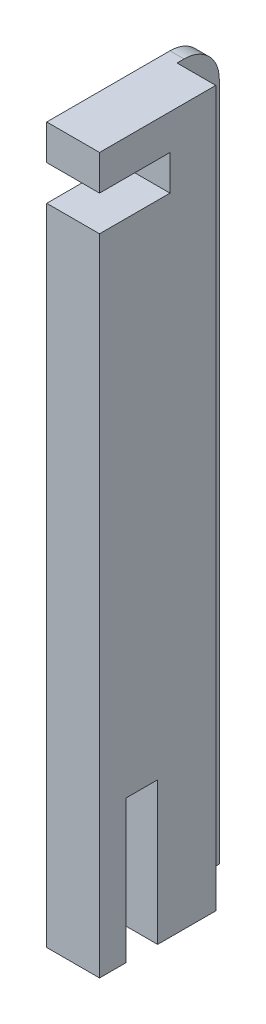
ISO-10303-21;
HEADER;
FILE_DESCRIPTION(('STEP AP214'),'2;1');
FILE_NAME('part.step','',(''),(''),'','','');
FILE_SCHEMA(('AUTOMOTIVE_DESIGN { 1 0 10303 214 1 1 1 1 }'));
ENDSEC;
DATA;
#1=APPLICATION_CONTEXT('core data for automotive mechanical design processes');
#2=APPLICATION_PROTOCOL_DEFINITION('international standard','automotive_design',2000,#1);
#3=PRODUCT_CONTEXT('',#1,'mechanical');
#4=PRODUCT('Part','Part','',(#3));
#5=PRODUCT_RELATED_PRODUCT_CATEGORY('part','',(#4));
#6=PRODUCT_DEFINITION_FORMATION('','',#4);
#7=PRODUCT_DEFINITION_CONTEXT('part definition',#1,'design');
#8=PRODUCT_DEFINITION('design','',#6,#7);
#9=PRODUCT_DEFINITION_SHAPE('','',#8);
#10=(LENGTH_UNIT() NAMED_UNIT(*) SI_UNIT(.MILLI.,.METRE.));
#11=(NAMED_UNIT(*) PLANE_ANGLE_UNIT() SI_UNIT($,.RADIAN.));
#12=(NAMED_UNIT(*) SI_UNIT($,.STERADIAN.) SOLID_ANGLE_UNIT());
#13=UNCERTAINTY_MEASURE_WITH_UNIT(LENGTH_MEASURE(1.E-05),#10,'distance_accuracy_value','');
#14=(GEOMETRIC_REPRESENTATION_CONTEXT(3) GLOBAL_UNCERTAINTY_ASSIGNED_CONTEXT((#13)) GLOBAL_UNIT_ASSIGNED_CONTEXT((#10,
#11,#12)) REPRESENTATION_CONTEXT('',''));
#15=CARTESIAN_POINT('',(0.,0.,0.));
#16=DIRECTION('',(0.,0.,1.));
#17=DIRECTION('',(1.,0.,0.));
#18=AXIS2_PLACEMENT_3D('',#15,#16,#17);
#19=CARTESIAN_POINT('',(0.,0.,26.));
#20=DIRECTION('',(0.,0.,1.));
#21=DIRECTION('',(1.,0.,0.));
#22=AXIS2_PLACEMENT_3D('',#19,#20,#21);
#23=PLANE('',#22);
#24=DIRECTION('',(0.,-1.,0.));
#25=VECTOR('',#24,1.);
#26=CARTESIAN_POINT('',(168.,-19.9999999999999,26.));
#27=LINE('',#26,#25);
#28=CARTESIAN_POINT('',(168.,0.,26.));
#29=VERTEX_POINT('',#28);
#30=CARTESIAN_POINT('',(168.,-9.99999999999994,26.));
#31=VERTEX_POINT('',#30);
#32=EDGE_CURVE('E233',#29,#31,#27,.T.);
#33=ORIENTED_EDGE('',*,*,#32,.T.);
#34=DIRECTION('',(1.,0.,0.));
#35=VECTOR('',#34,1.);
#36=CARTESIAN_POINT('',(-434.,-10.,26.));
#37=LINE('',#36,#35);
#38=CARTESIAN_POINT('',(183.,-9.99999999999994,26.));
#39=VERTEX_POINT('',#38);
#40=EDGE_CURVE('E194',#31,#39,#37,.T.);
#41=ORIENTED_EDGE('',*,*,#40,.T.);
#42=DIRECTION('',(0.,-1.,0.));
#43=VECTOR('',#42,1.);
#44=CARTESIAN_POINT('',(183.,0.,26.));
#45=LINE('',#44,#43);
#46=CARTESIAN_POINT('',(183.,0.,26.));
#47=VERTEX_POINT('',#46);
#48=EDGE_CURVE('E229',#47,#39,#45,.T.);
#49=ORIENTED_EDGE('',*,*,#48,.F.);
#50=DIRECTION('',(-1.,0.,0.));
#51=VECTOR('',#50,1.);
#52=CARTESIAN_POINT('',(-168.,0.,26.));
#53=LINE('',#52,#51);
#54=EDGE_CURVE('E223',#47,#29,#53,.T.);
#55=ORIENTED_EDGE('',*,*,#54,.T.);
#56=EDGE_LOOP('',(#33,#41,#49,#55));
#57=FACE_BOUND('',#56,.T.);
#58=ADVANCED_FACE('F35',(#57),#23,.T.);
#59=DIRECTION('',(-1.,0.,0.));
#60=VECTOR('',#59,1.);
#61=CARTESIAN_POINT('',(205.,-203.,26.));
#62=LINE('',#61,#60);
#63=CARTESIAN_POINT('',(183.,-203.,26.));
#64=VERTEX_POINT('',#63);
#65=CARTESIAN_POINT('',(168.,-203.,26.));
#66=VERTEX_POINT('',#65);
#67=EDGE_CURVE('E181',#64,#66,#62,.T.);
#68=ORIENTED_EDGE('',*,*,#67,.F.);
#69=CARTESIAN_POINT('',(183.,-20.,26.));
#70=VERTEX_POINT('',#69);
#71=EDGE_CURVE('E228',#70,#64,#45,.T.);
#72=ORIENTED_EDGE('',*,*,#71,.F.);
#73=DIRECTION('',(1.,0.,0.));
#74=VECTOR('',#73,1.);
#75=CARTESIAN_POINT('',(-434.,-20.,26.));
#76=LINE('',#75,#74);
#77=CARTESIAN_POINT('',(168.,-19.9999999999999,26.));
#78=VERTEX_POINT('',#77);
#79=EDGE_CURVE('E58',#78,#70,#76,.T.);
#80=ORIENTED_EDGE('',*,*,#79,.F.);
#81=EDGE_CURVE('E232',#78,#66,#27,.T.);
#82=ORIENTED_EDGE('',*,*,#81,.T.);
#83=EDGE_LOOP('',(#68,#72,#80,#82));
#84=FACE_BOUND('',#83,.T.);
#85=ADVANCED_FACE('F268',(#84),#23,.T.);
#86=CARTESIAN_POINT('',(168.,-19.9999999999999,26.));
#87=DIRECTION('',(1.,0.,0.));
#88=DIRECTION('',(0.,1.,0.));
#89=AXIS2_PLACEMENT_3D('',#86,#87,#88);
#90=PLANE('',#89);
#91=DIRECTION('',(0.,1.,0.));
#92=VECTOR('',#91,1.);
#93=CARTESIAN_POINT('',(168.,0.,18.5));
#94=LINE('',#93,#92);
#95=CARTESIAN_POINT('',(168.,-203.,18.5));
#96=VERTEX_POINT('',#95);
#97=CARTESIAN_POINT('',(168.,-162.5,18.5));
#98=VERTEX_POINT('',#97);
#99=EDGE_CURVE('E170',#96,#98,#94,.T.);
#100=ORIENTED_EDGE('',*,*,#99,.F.);
#101=DIRECTION('',(0.,0.,-1.));
#102=VECTOR('',#101,1.);
#103=CARTESIAN_POINT('',(168.,-203.,0.));
#104=LINE('',#103,#102);
#105=EDGE_CURVE('E167',#66,#96,#104,.T.);
#106=ORIENTED_EDGE('',*,*,#105,.F.);
#107=ORIENTED_EDGE('',*,*,#81,.F.);
#108=DIRECTION('',(0.,0.,1.));
#109=VECTOR('',#108,1.);
#110=CARTESIAN_POINT('',(168.,-19.9999999999999,26.));
#111=LINE('',#110,#109);
#112=CARTESIAN_POINT('',(168.,-19.9999999999999,6.00000000000002));
#113=VERTEX_POINT('',#112);
#114=EDGE_CURVE('E197',#113,#78,#111,.T.);
#115=ORIENTED_EDGE('',*,*,#114,.F.);
#116=DIRECTION('',(0.,-1.,0.));
#117=VECTOR('',#116,1.);
#118=CARTESIAN_POINT('',(168.,-19.9999999999999,6.00000000000002));
#119=LINE('',#118,#117);
#120=CARTESIAN_POINT('',(168.,-9.99999999999994,6.00000000000002));
#121=VERTEX_POINT('',#120);
#122=EDGE_CURVE('E204',#121,#113,#119,.T.);
#123=ORIENTED_EDGE('',*,*,#122,.F.);
#124=DIRECTION('',(0.,0.,-1.));
#125=VECTOR('',#124,1.);
#126=CARTESIAN_POINT('',(168.,-9.99999999999994,26.));
#127=LINE('',#126,#125);
#128=EDGE_CURVE('E206',#31,#121,#127,.T.);
#129=ORIENTED_EDGE('',*,*,#128,.F.);
#130=ORIENTED_EDGE('',*,*,#32,.F.);
#131=DIRECTION('',(0.,0.,1.));
#132=VECTOR('',#131,1.);
#133=CARTESIAN_POINT('',(168.,0.,-19.));
#134=LINE('',#133,#132);
#135=CARTESIAN_POINT('',(168.,0.,-9.));
#136=VERTEX_POINT('',#135);
#137=EDGE_CURVE('E220',#136,#29,#134,.T.);
#138=ORIENTED_EDGE('',*,*,#137,.F.);
#139=CARTESIAN_POINT('',(168.,-9.99999999999996,-9.));
#140=DIRECTION('',(1.,0.,0.));
#141=DIRECTION('',(0.,1.,0.));
#142=AXIS2_PLACEMENT_3D('',#139,#140,#141);
#143=CIRCLE('',#142,10.);
#144=CARTESIAN_POINT('',(168.,-9.99999999999996,-19.));
#145=VERTEX_POINT('',#144);
#146=EDGE_CURVE('E245',#136,#145,#143,.F.);
#147=ORIENTED_EDGE('',*,*,#146,.T.);
#148=DIRECTION('',(0.,1.,0.));
#149=VECTOR('',#148,1.);
#150=CARTESIAN_POINT('',(168.,0.,-19.));
#151=LINE('',#150,#149);
#152=CARTESIAN_POINT('',(168.,-203.,-19.));
#153=VERTEX_POINT('',#152);
#154=EDGE_CURVE('E166',#153,#145,#151,.T.);
#155=ORIENTED_EDGE('',*,*,#154,.F.);
#156=DIRECTION('',(0.,0.,-1.));
#157=VECTOR('',#156,1.);
#158=CARTESIAN_POINT('',(168.,-203.,0.));
#159=LINE('',#158,#157);
#160=CARTESIAN_POINT('',(168.,-203.,9.5));
#161=VERTEX_POINT('',#160);
#162=EDGE_CURVE('E144',#161,#153,#159,.T.);
#163=ORIENTED_EDGE('',*,*,#162,.F.);
#164=DIRECTION('',(0.,-1.,0.));
#165=VECTOR('',#164,1.);
#166=CARTESIAN_POINT('',(168.,0.,9.5));
#167=LINE('',#166,#165);
#168=CARTESIAN_POINT('',(168.,-162.5,9.5));
#169=VERTEX_POINT('',#168);
#170=EDGE_CURVE('E154',#169,#161,#167,.T.);
#171=ORIENTED_EDGE('',*,*,#170,.F.);
#172=DIRECTION('',(0.,0.,-1.));
#173=VECTOR('',#172,1.);
#174=CARTESIAN_POINT('',(168.,-162.5,0.));
#175=LINE('',#174,#173);
#176=EDGE_CURVE('E151',#98,#169,#175,.T.);
#177=ORIENTED_EDGE('',*,*,#176,.F.);
#178=EDGE_LOOP('',(#100,#106,#107,#115,#123,#129,#130,#138,#147,#155,#163,#171,#177));
#179=FACE_BOUND('',#178,.T.);
#180=ADVANCED_FACE('F164',(#179),#90,.F.);
#181=CARTESIAN_POINT('',(183.,0.,26.));
#182=DIRECTION('',(1.,0.,0.));
#183=DIRECTION('',(0.,1.,0.));
#184=AXIS2_PLACEMENT_3D('',#181,#182,#183);
#185=PLANE('',#184);
#186=DIRECTION('',(0.,0.,1.));
#187=VECTOR('',#186,1.);
#188=CARTESIAN_POINT('',(183.,-203.,26.));
#189=LINE('',#188,#187);
#190=CARTESIAN_POINT('',(183.,-203.,18.5));
#191=VERTEX_POINT('',#190);
#192=EDGE_CURVE('E11',#191,#64,#189,.T.);
#193=ORIENTED_EDGE('',*,*,#192,.F.);
#194=DIRECTION('',(0.,-1.,0.));
#195=VECTOR('',#194,1.);
#196=CARTESIAN_POINT('',(183.,0.,18.5));
#197=LINE('',#196,#195);
#198=CARTESIAN_POINT('',(183.,-162.5,18.5));
#199=VERTEX_POINT('',#198);
#200=EDGE_CURVE('E43',#199,#191,#197,.T.);
#201=ORIENTED_EDGE('',*,*,#200,.F.);
#202=DIRECTION('',(0.,0.,1.));
#203=VECTOR('',#202,1.);
#204=CARTESIAN_POINT('',(183.,-162.5,26.));
#205=LINE('',#204,#203);
#206=CARTESIAN_POINT('',(183.,-162.5,9.5));
#207=VERTEX_POINT('',#206);
#208=EDGE_CURVE('E251',#207,#199,#205,.T.);
#209=ORIENTED_EDGE('',*,*,#208,.F.);
#210=DIRECTION('',(0.,1.,0.));
#211=VECTOR('',#210,1.);
#212=CARTESIAN_POINT('',(183.,0.,9.5));
#213=LINE('',#212,#211);
#214=CARTESIAN_POINT('',(183.,-203.,9.5));
#215=VERTEX_POINT('',#214);
#216=EDGE_CURVE('E249',#215,#207,#213,.T.);
#217=ORIENTED_EDGE('',*,*,#216,.F.);
#218=DIRECTION('',(0.,0.,1.));
#219=VECTOR('',#218,1.);
#220=CARTESIAN_POINT('',(183.,-203.,26.));
#221=LINE('',#220,#219);
#222=CARTESIAN_POINT('',(183.,-203.,-7.));
#223=VERTEX_POINT('',#222);
#224=EDGE_CURVE('E147',#223,#215,#221,.T.);
#225=ORIENTED_EDGE('',*,*,#224,.F.);
#226=DIRECTION('',(0.,-1.,0.));
#227=VECTOR('',#226,1.);
#228=CARTESIAN_POINT('',(183.,0.,-7.));
#229=LINE('',#228,#227);
#230=CARTESIAN_POINT('',(183.,0.,-7.));
#231=VERTEX_POINT('',#230);
#232=EDGE_CURVE('E208',#231,#223,#229,.T.);
#233=ORIENTED_EDGE('',*,*,#232,.F.);
#234=DIRECTION('',(0.,0.,-1.));
#235=VECTOR('',#234,1.);
#236=CARTESIAN_POINT('',(183.,0.,26.));
#237=LINE('',#236,#235);
#238=EDGE_CURVE('E236',#47,#231,#237,.T.);
#239=ORIENTED_EDGE('',*,*,#238,.F.);
#240=ORIENTED_EDGE('',*,*,#48,.T.);
#241=DIRECTION('',(0.,0.,-1.));
#242=VECTOR('',#241,1.);
#243=CARTESIAN_POINT('',(183.,-9.99999999999993,0.));
#244=LINE('',#243,#242);
#245=CARTESIAN_POINT('',(183.,-9.99999999999994,6.00000000000002));
#246=VERTEX_POINT('',#245);
#247=EDGE_CURVE('E186',#39,#246,#244,.T.);
#248=ORIENTED_EDGE('',*,*,#247,.T.);
#249=DIRECTION('',(0.,-1.,0.));
#250=VECTOR('',#249,1.);
#251=CARTESIAN_POINT('',(183.,0.,6.00000000000002));
#252=LINE('',#251,#250);
#253=CARTESIAN_POINT('',(183.,-19.9999999999999,6.00000000000002));
#254=VERTEX_POINT('',#253);
#255=EDGE_CURVE('E191',#246,#254,#252,.T.);
#256=ORIENTED_EDGE('',*,*,#255,.T.);
#257=DIRECTION('',(0.,0.,1.));
#258=VECTOR('',#257,1.);
#259=CARTESIAN_POINT('',(183.,-19.9999999999999,0.));
#260=LINE('',#259,#258);
#261=EDGE_CURVE('E189',#254,#70,#260,.T.);
#262=ORIENTED_EDGE('',*,*,#261,.T.);
#263=ORIENTED_EDGE('',*,*,#71,.T.);
#264=EDGE_LOOP('',(#193,#201,#209,#217,#225,#233,#239,#240,#248,#256,#262,#263));
#265=FACE_BOUND('',#264,.T.);
#266=ADVANCED_FACE('F265',(#265),#185,.T.);
#267=CARTESIAN_POINT('',(168.,0.,26.));
#268=DIRECTION('',(0.,1.,0.));
#269=DIRECTION('',(-1.,0.,0.));
#270=AXIS2_PLACEMENT_3D('',#267,#268,#269);
#271=PLANE('',#270);
#272=ORIENTED_EDGE('',*,*,#137,.T.);
#273=ORIENTED_EDGE('',*,*,#54,.F.);
#274=ORIENTED_EDGE('',*,*,#238,.T.);
#275=DIRECTION('',(1.,0.,0.));
#276=VECTOR('',#275,1.);
#277=CARTESIAN_POINT('',(0.,0.,-7.));
#278=LINE('',#277,#276);
#279=CARTESIAN_POINT('',(172.,0.,-7.));
#280=VERTEX_POINT('',#279);
#281=EDGE_CURVE('E211',#280,#231,#278,.T.);
#282=ORIENTED_EDGE('',*,*,#281,.F.);
#283=DIRECTION('',(0.,0.,1.));
#284=VECTOR('',#283,1.);
#285=CARTESIAN_POINT('',(172.,0.,-19.));
#286=LINE('',#285,#284);
#287=CARTESIAN_POINT('',(172.,0.,-9.));
#288=VERTEX_POINT('',#287);
#289=EDGE_CURVE('E219',#288,#280,#286,.T.);
#290=ORIENTED_EDGE('',*,*,#289,.F.);
#291=DIRECTION('',(1.,0.,0.));
#292=VECTOR('',#291,1.);
#293=CARTESIAN_POINT('',(168.,0.,-9.));
#294=LINE('',#293,#292);
#295=EDGE_CURVE('E238',#288,#136,#294,.F.);
#296=ORIENTED_EDGE('',*,*,#295,.T.);
#297=EDGE_LOOP('',(#272,#273,#274,#282,#290,#296));
#298=FACE_BOUND('',#297,.T.);
#299=ADVANCED_FACE('F282',(#298),#271,.T.);
#300=CARTESIAN_POINT('',(172.,0.,-19.));
#301=DIRECTION('',(1.,0.,0.));
#302=DIRECTION('',(0.,1.,0.));
#303=AXIS2_PLACEMENT_3D('',#300,#301,#302);
#304=PLANE('',#303);
#305=DIRECTION('',(0.,0.,1.));
#306=VECTOR('',#305,1.);
#307=CARTESIAN_POINT('',(172.,-203.,-19.));
#308=LINE('',#307,#306);
#309=CARTESIAN_POINT('',(172.,-203.,-19.));
#310=VERTEX_POINT('',#309);
#311=CARTESIAN_POINT('',(172.,-203.,-7.));
#312=VERTEX_POINT('',#311);
#313=EDGE_CURVE('E50',#310,#312,#308,.T.);
#314=ORIENTED_EDGE('',*,*,#313,.F.);
#315=DIRECTION('',(0.,1.,0.));
#316=VECTOR('',#315,1.);
#317=CARTESIAN_POINT('',(172.,0.,-19.));
#318=LINE('',#317,#316);
#319=CARTESIAN_POINT('',(172.,-9.99999999999996,-19.));
#320=VERTEX_POINT('',#319);
#321=EDGE_CURVE('E217',#310,#320,#318,.T.);
#322=ORIENTED_EDGE('',*,*,#321,.T.);
#323=CARTESIAN_POINT('',(172.,-9.99999999999996,-9.));
#324=DIRECTION('',(1.,0.,0.));
#325=DIRECTION('',(0.,1.,0.));
#326=AXIS2_PLACEMENT_3D('',#323,#324,#325);
#327=CIRCLE('',#326,10.);
#328=EDGE_CURVE('E243',#320,#288,#327,.T.);
#329=ORIENTED_EDGE('',*,*,#328,.T.);
#330=ORIENTED_EDGE('',*,*,#289,.T.);
#331=DIRECTION('',(0.,1.,0.));
#332=VECTOR('',#331,1.);
#333=CARTESIAN_POINT('',(172.,0.,-7.));
#334=LINE('',#333,#332);
#335=EDGE_CURVE('E214',#312,#280,#334,.T.);
#336=ORIENTED_EDGE('',*,*,#335,.F.);
#337=EDGE_LOOP('',(#314,#322,#329,#330,#336));
#338=FACE_BOUND('',#337,.T.);
#339=ADVANCED_FACE('F285',(#338),#304,.T.);
#340=CARTESIAN_POINT('',(0.,0.,-19.));
#341=DIRECTION('',(0.,0.,1.));
#342=DIRECTION('',(1.,0.,0.));
#343=AXIS2_PLACEMENT_3D('',#340,#341,#342);
#344=PLANE('',#343);
#345=ORIENTED_EDGE('',*,*,#321,.F.);
#346=DIRECTION('',(-1.,0.,0.));
#347=VECTOR('',#346,1.);
#348=CARTESIAN_POINT('',(205.,-203.,-19.));
#349=LINE('',#348,#347);
#350=EDGE_CURVE('E150',#310,#153,#349,.T.);
#351=ORIENTED_EDGE('',*,*,#350,.T.);
#352=ORIENTED_EDGE('',*,*,#154,.T.);
#353=DIRECTION('',(1.,0.,0.));
#354=VECTOR('',#353,1.);
#355=CARTESIAN_POINT('',(172.,-9.99999999999996,-19.));
#356=LINE('',#355,#354);
#357=EDGE_CURVE('E240',#145,#320,#356,.T.);
#358=ORIENTED_EDGE('',*,*,#357,.T.);
#359=EDGE_LOOP('',(#345,#351,#352,#358));
#360=FACE_BOUND('',#359,.T.);
#361=ADVANCED_FACE('F292',(#360),#344,.F.);
#362=CARTESIAN_POINT('',(0.,-9.99999999999998,-9.));
#363=DIRECTION('',(-1.,0.,0.));
#364=DIRECTION('',(0.,-1.,0.));
#365=AXIS2_PLACEMENT_3D('',#362,#363,#364);
#366=CYLINDRICAL_SURFACE('',#365,10.);
#367=ORIENTED_EDGE('',*,*,#146,.F.);
#368=ORIENTED_EDGE('',*,*,#295,.F.);
#369=ORIENTED_EDGE('',*,*,#328,.F.);
#370=ORIENTED_EDGE('',*,*,#357,.F.);
#371=EDGE_LOOP('',(#367,#368,#369,#370));
#372=FACE_BOUND('',#371,.T.);
#373=ADVANCED_FACE('F37',(#372),#366,.T.);
#374=CARTESIAN_POINT('',(0.,0.,-7.));
#375=DIRECTION('',(0.,0.,1.));
#376=DIRECTION('',(1.,0.,0.));
#377=AXIS2_PLACEMENT_3D('',#374,#375,#376);
#378=PLANE('',#377);
#379=ORIENTED_EDGE('',*,*,#232,.T.);
#380=DIRECTION('',(-1.,0.,0.));
#381=VECTOR('',#380,1.);
#382=CARTESIAN_POINT('',(0.,-203.,-7.));
#383=LINE('',#382,#381);
#384=EDGE_CURVE('E247',#223,#312,#383,.T.);
#385=ORIENTED_EDGE('',*,*,#384,.T.);
#386=ORIENTED_EDGE('',*,*,#335,.T.);
#387=ORIENTED_EDGE('',*,*,#281,.T.);
#388=EDGE_LOOP('',(#379,#385,#386,#387));
#389=FACE_BOUND('',#388,.T.);
#390=ADVANCED_FACE('F277',(#389),#378,.F.);
#391=CARTESIAN_POINT('',(-434.,-10.,0.));
#392=DIRECTION('',(0.,-1.,0.));
#393=DIRECTION('',(0.,0.,-1.));
#394=AXIS2_PLACEMENT_3D('',#391,#392,#393);
#395=PLANE('',#394);
#396=ORIENTED_EDGE('',*,*,#128,.T.);
#397=DIRECTION('',(1.,0.,0.));
#398=VECTOR('',#397,1.);
#399=CARTESIAN_POINT('',(-434.,-10.,6.00000000000002));
#400=LINE('',#399,#398);
#401=EDGE_CURVE('E195',#121,#246,#400,.T.);
#402=ORIENTED_EDGE('',*,*,#401,.T.);
#403=ORIENTED_EDGE('',*,*,#247,.F.);
#404=ORIENTED_EDGE('',*,*,#40,.F.);
#405=EDGE_LOOP('',(#396,#402,#403,#404));
#406=FACE_BOUND('',#405,.T.);
#407=ADVANCED_FACE('F299',(#406),#395,.T.);
#408=CARTESIAN_POINT('',(-434.,0.,6.00000000000002));
#409=DIRECTION('',(0.,0.,1.));
#410=DIRECTION('',(1.,0.,0.));
#411=AXIS2_PLACEMENT_3D('',#408,#409,#410);
#412=PLANE('',#411);
#413=ORIENTED_EDGE('',*,*,#122,.T.);
#414=DIRECTION('',(1.,0.,0.));
#415=VECTOR('',#414,1.);
#416=CARTESIAN_POINT('',(-434.,-20.,6.00000000000002));
#417=LINE('',#416,#415);
#418=EDGE_CURVE('E198',#113,#254,#417,.T.);
#419=ORIENTED_EDGE('',*,*,#418,.T.);
#420=ORIENTED_EDGE('',*,*,#255,.F.);
#421=ORIENTED_EDGE('',*,*,#401,.F.);
#422=EDGE_LOOP('',(#413,#419,#420,#421));
#423=FACE_BOUND('',#422,.T.);
#424=ADVANCED_FACE('F303',(#423),#412,.T.);
#425=CARTESIAN_POINT('',(-434.,-20.,0.));
#426=DIRECTION('',(0.,1.,0.));
#427=DIRECTION('',(0.,0.,1.));
#428=AXIS2_PLACEMENT_3D('',#425,#426,#427);
#429=PLANE('',#428);
#430=ORIENTED_EDGE('',*,*,#114,.T.);
#431=ORIENTED_EDGE('',*,*,#79,.T.);
#432=ORIENTED_EDGE('',*,*,#261,.F.);
#433=ORIENTED_EDGE('',*,*,#418,.F.);
#434=EDGE_LOOP('',(#430,#431,#432,#433));
#435=FACE_BOUND('',#434,.T.);
#436=ADVANCED_FACE('F305',(#435),#429,.T.);
#437=CARTESIAN_POINT('',(205.,0.,9.5));
#438=DIRECTION('',(0.,0.,-1.));
#439=DIRECTION('',(-1.,0.,0.));
#440=AXIS2_PLACEMENT_3D('',#437,#438,#439);
#441=PLANE('',#440);
#442=ORIENTED_EDGE('',*,*,#216,.T.);
#443=DIRECTION('',(-1.,0.,0.));
#444=VECTOR('',#443,1.);
#445=CARTESIAN_POINT('',(205.,-162.5,9.5));
#446=LINE('',#445,#444);
#447=EDGE_CURVE('E157',#207,#169,#446,.T.);
#448=ORIENTED_EDGE('',*,*,#447,.T.);
#449=ORIENTED_EDGE('',*,*,#170,.T.);
#450=DIRECTION('',(-1.,0.,0.));
#451=VECTOR('',#450,1.);
#452=CARTESIAN_POINT('',(205.,-203.,9.5));
#453=LINE('',#452,#451);
#454=EDGE_CURVE('E140',#215,#161,#453,.T.);
#455=ORIENTED_EDGE('',*,*,#454,.F.);
#456=EDGE_LOOP('',(#442,#448,#449,#455));
#457=FACE_BOUND('',#456,.T.);
#458=ADVANCED_FACE('F155',(#457),#441,.F.);
#459=CARTESIAN_POINT('',(205.,-162.5,0.));
#460=DIRECTION('',(0.,1.,0.));
#461=DIRECTION('',(-1.,0.,0.));
#462=AXIS2_PLACEMENT_3D('',#459,#460,#461);
#463=PLANE('',#462);
#464=ORIENTED_EDGE('',*,*,#208,.T.);
#465=DIRECTION('',(-1.,0.,0.));
#466=VECTOR('',#465,1.);
#467=CARTESIAN_POINT('',(205.,-162.5,18.5));
#468=LINE('',#467,#466);
#469=EDGE_CURVE('E177',#199,#98,#468,.T.);
#470=ORIENTED_EDGE('',*,*,#469,.T.);
#471=ORIENTED_EDGE('',*,*,#176,.T.);
#472=ORIENTED_EDGE('',*,*,#447,.F.);
#473=EDGE_LOOP('',(#464,#470,#471,#472));
#474=FACE_BOUND('',#473,.T.);
#475=ADVANCED_FACE('F273',(#474),#463,.F.);
#476=CARTESIAN_POINT('',(205.,0.,18.5));
#477=DIRECTION('',(0.,0.,1.));
#478=DIRECTION('',(1.,0.,0.));
#479=AXIS2_PLACEMENT_3D('',#476,#477,#478);
#480=PLANE('',#479);
#481=ORIENTED_EDGE('',*,*,#200,.T.);
#482=DIRECTION('',(-1.,0.,0.));
#483=VECTOR('',#482,1.);
#484=CARTESIAN_POINT('',(205.,-203.,18.5));
#485=LINE('',#484,#483);
#486=EDGE_CURVE('E179',#191,#96,#485,.T.);
#487=ORIENTED_EDGE('',*,*,#486,.T.);
#488=ORIENTED_EDGE('',*,*,#99,.T.);
#489=ORIENTED_EDGE('',*,*,#469,.F.);
#490=EDGE_LOOP('',(#481,#487,#488,#489));
#491=FACE_BOUND('',#490,.T.);
#492=ADVANCED_FACE('F256',(#491),#480,.F.);
#493=CARTESIAN_POINT('',(205.,-203.,0.));
#494=DIRECTION('',(0.,1.,0.));
#495=DIRECTION('',(-1.,0.,0.));
#496=AXIS2_PLACEMENT_3D('',#493,#494,#495);
#497=PLANE('',#496);
#498=ORIENTED_EDGE('',*,*,#192,.T.);
#499=ORIENTED_EDGE('',*,*,#67,.T.);
#500=ORIENTED_EDGE('',*,*,#105,.T.);
#501=ORIENTED_EDGE('',*,*,#486,.F.);
#502=EDGE_LOOP('',(#498,#499,#500,#501));
#503=FACE_BOUND('',#502,.T.);
#504=ADVANCED_FACE('F261',(#503),#497,.F.);
#505=CARTESIAN_POINT('',(205.,-203.,0.));
#506=DIRECTION('',(0.,1.,0.));
#507=DIRECTION('',(-1.,0.,0.));
#508=AXIS2_PLACEMENT_3D('',#505,#506,#507);
#509=PLANE('',#508);
#510=ORIENTED_EDGE('',*,*,#224,.T.);
#511=ORIENTED_EDGE('',*,*,#454,.T.);
#512=ORIENTED_EDGE('',*,*,#162,.T.);
#513=ORIENTED_EDGE('',*,*,#350,.F.);
#514=ORIENTED_EDGE('',*,*,#313,.T.);
#515=ORIENTED_EDGE('',*,*,#384,.F.);
#516=EDGE_LOOP('',(#510,#511,#512,#513,#514,#515));
#517=FACE_BOUND('',#516,.T.);
#518=ADVANCED_FACE('F142',(#517),#509,.F.);
#519=CLOSED_SHELL('',(#58,#85,#180,#266,#299,#339,#361,#373,#390,#407,#424,#436,#458,#475,#492,
#504,#518));
#520=MANIFOLD_SOLID_BREP('B2',#519);
#521=ADVANCED_BREP_SHAPE_REPRESENTATION('',(#18,#520),#14);
#522=SHAPE_DEFINITION_REPRESENTATION(#9,#521);
ENDSEC;
END-ISO-10303-21;
